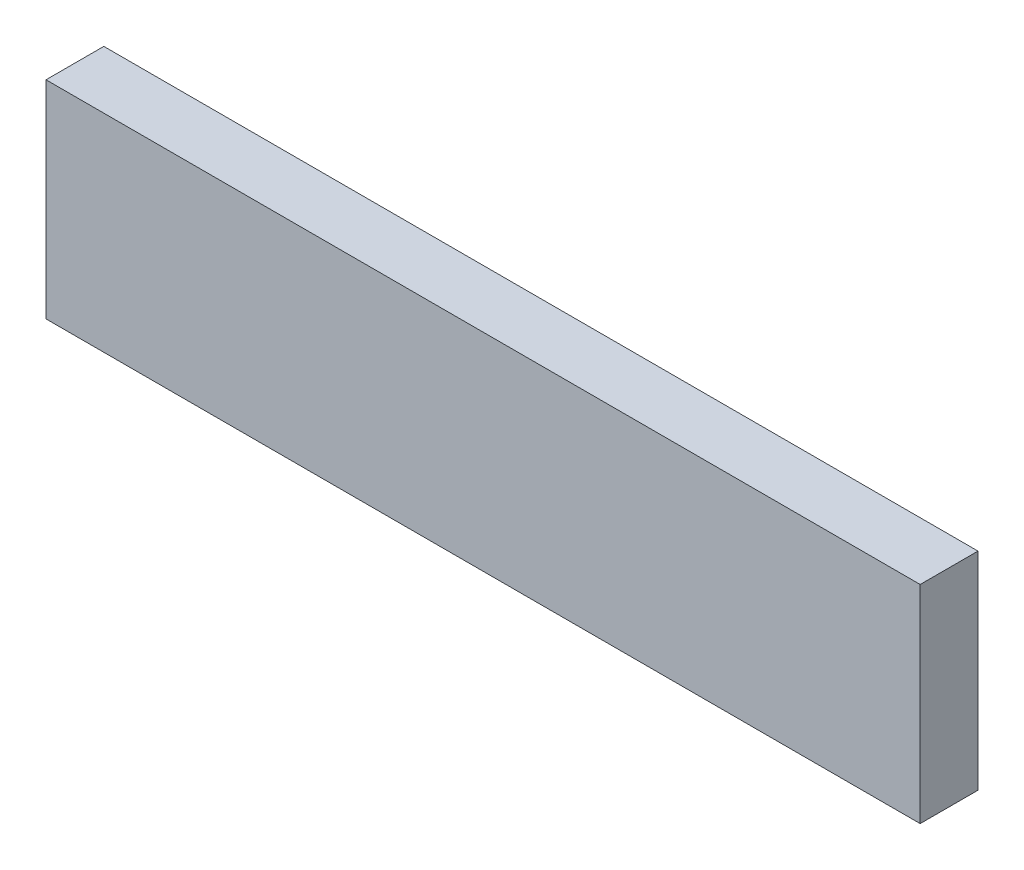
ISO-10303-21;
HEADER;
FILE_DESCRIPTION(('STEP AP214'),'2;1');
FILE_NAME('part.step','',(''),(''),'','','');
FILE_SCHEMA(('AUTOMOTIVE_DESIGN { 1 0 10303 214 1 1 1 1 }'));
ENDSEC;
DATA;
#1=APPLICATION_CONTEXT('core data for automotive mechanical design processes');
#2=APPLICATION_PROTOCOL_DEFINITION('international standard','automotive_design',2000,#1);
#3=PRODUCT_CONTEXT('',#1,'mechanical');
#4=PRODUCT('Part','Part','',(#3));
#5=PRODUCT_RELATED_PRODUCT_CATEGORY('part','',(#4));
#6=PRODUCT_DEFINITION_FORMATION('','',#4);
#7=PRODUCT_DEFINITION_CONTEXT('part definition',#1,'design');
#8=PRODUCT_DEFINITION('design','',#6,#7);
#9=PRODUCT_DEFINITION_SHAPE('','',#8);
#10=(LENGTH_UNIT() NAMED_UNIT(*) SI_UNIT(.MILLI.,.METRE.));
#11=(NAMED_UNIT(*) PLANE_ANGLE_UNIT() SI_UNIT($,.RADIAN.));
#12=(NAMED_UNIT(*) SI_UNIT($,.STERADIAN.) SOLID_ANGLE_UNIT());
#13=UNCERTAINTY_MEASURE_WITH_UNIT(LENGTH_MEASURE(1.E-05),#10,'distance_accuracy_value','');
#14=(GEOMETRIC_REPRESENTATION_CONTEXT(3) GLOBAL_UNCERTAINTY_ASSIGNED_CONTEXT((#13)) GLOBAL_UNIT_ASSIGNED_CONTEXT((#10,
#11,#12)) REPRESENTATION_CONTEXT('',''));
#15=CARTESIAN_POINT('',(0.,0.,0.));
#16=DIRECTION('',(0.,0.,1.));
#17=DIRECTION('',(1.,0.,0.));
#18=AXIS2_PLACEMENT_3D('',#15,#16,#17);
#19=CARTESIAN_POINT('',(-47.99,-11.37,6.35));
#20=DIRECTION('',(1.,0.,0.));
#21=DIRECTION('',(0.,0.,-1.));
#22=AXIS2_PLACEMENT_3D('',#19,#20,#21);
#23=PLANE('',#22);
#24=DIRECTION('',(0.,-1.,0.));
#25=VECTOR('',#24,1.);
#26=CARTESIAN_POINT('',(-47.99,-11.37,0.));
#27=LINE('',#26,#25);
#28=CARTESIAN_POINT('',(-47.99,11.37,0.));
#29=VERTEX_POINT('',#28);
#30=CARTESIAN_POINT('',(-47.99,-11.37,0.));
#31=VERTEX_POINT('',#30);
#32=EDGE_CURVE('E111',#29,#31,#27,.T.);
#33=ORIENTED_EDGE('',*,*,#32,.T.);
#34=DIRECTION('',(0.,0.,-1.));
#35=VECTOR('',#34,1.);
#36=CARTESIAN_POINT('',(-47.99,-11.37,6.35));
#37=LINE('',#36,#35);
#38=CARTESIAN_POINT('',(-47.99,-11.37,6.35));
#39=VERTEX_POINT('',#38);
#40=EDGE_CURVE('E11',#39,#31,#37,.T.);
#41=ORIENTED_EDGE('',*,*,#40,.F.);
#42=DIRECTION('',(0.,-1.,0.));
#43=VECTOR('',#42,1.);
#44=CARTESIAN_POINT('',(-47.99,-11.37,6.35));
#45=LINE('',#44,#43);
#46=CARTESIAN_POINT('',(-47.99,11.37,6.35));
#47=VERTEX_POINT('',#46);
#48=EDGE_CURVE('E95',#47,#39,#45,.T.);
#49=ORIENTED_EDGE('',*,*,#48,.F.);
#50=DIRECTION('',(0.,0.,-1.));
#51=VECTOR('',#50,1.);
#52=CARTESIAN_POINT('',(-47.99,11.37,6.35));
#53=LINE('',#52,#51);
#54=EDGE_CURVE('E107',#47,#29,#53,.T.);
#55=ORIENTED_EDGE('',*,*,#54,.T.);
#56=EDGE_LOOP('',(#33,#41,#49,#55));
#57=FACE_BOUND('',#56,.T.);
#58=ADVANCED_FACE('F43',(#57),#23,.F.);
#59=CARTESIAN_POINT('',(47.99,-11.37,6.35));
#60=DIRECTION('',(0.,1.,0.));
#61=DIRECTION('',(-1.,0.,0.));
#62=AXIS2_PLACEMENT_3D('',#59,#60,#61);
#63=PLANE('',#62);
#64=DIRECTION('',(1.,0.,0.));
#65=VECTOR('',#64,1.);
#66=CARTESIAN_POINT('',(47.99,-11.37,0.));
#67=LINE('',#66,#65);
#68=CARTESIAN_POINT('',(47.99,-11.37,0.));
#69=VERTEX_POINT('',#68);
#70=EDGE_CURVE('E100',#31,#69,#67,.T.);
#71=ORIENTED_EDGE('',*,*,#70,.T.);
#72=DIRECTION('',(0.,0.,-1.));
#73=VECTOR('',#72,1.);
#74=CARTESIAN_POINT('',(47.99,-11.37,6.35));
#75=LINE('',#74,#73);
#76=CARTESIAN_POINT('',(47.99,-11.37,6.35));
#77=VERTEX_POINT('',#76);
#78=EDGE_CURVE('E52',#77,#69,#75,.T.);
#79=ORIENTED_EDGE('',*,*,#78,.F.);
#80=DIRECTION('',(1.,0.,0.));
#81=VECTOR('',#80,1.);
#82=CARTESIAN_POINT('',(47.99,-11.37,6.35));
#83=LINE('',#82,#81);
#84=EDGE_CURVE('E90',#39,#77,#83,.T.);
#85=ORIENTED_EDGE('',*,*,#84,.F.);
#86=ORIENTED_EDGE('',*,*,#40,.T.);
#87=EDGE_LOOP('',(#71,#79,#85,#86));
#88=FACE_BOUND('',#87,.T.);
#89=ADVANCED_FACE('F99',(#88),#63,.F.);
#90=CARTESIAN_POINT('',(47.99,-11.37,6.35));
#91=DIRECTION('',(-1.,0.,0.));
#92=DIRECTION('',(0.,0.,1.));
#93=AXIS2_PLACEMENT_3D('',#90,#91,#92);
#94=PLANE('',#93);
#95=DIRECTION('',(0.,1.,0.));
#96=VECTOR('',#95,1.);
#97=CARTESIAN_POINT('',(47.99,-11.37,0.));
#98=LINE('',#97,#96);
#99=CARTESIAN_POINT('',(47.99,11.37,0.));
#100=VERTEX_POINT('',#99);
#101=EDGE_CURVE('E77',#69,#100,#98,.T.);
#102=ORIENTED_EDGE('',*,*,#101,.T.);
#103=DIRECTION('',(0.,0.,-1.));
#104=VECTOR('',#103,1.);
#105=CARTESIAN_POINT('',(47.99,11.37,6.35));
#106=LINE('',#105,#104);
#107=CARTESIAN_POINT('',(47.99,11.37,6.35));
#108=VERTEX_POINT('',#107);
#109=EDGE_CURVE('E102',#108,#100,#106,.T.);
#110=ORIENTED_EDGE('',*,*,#109,.F.);
#111=DIRECTION('',(0.,1.,0.));
#112=VECTOR('',#111,1.);
#113=CARTESIAN_POINT('',(47.99,-11.37,6.35));
#114=LINE('',#113,#112);
#115=EDGE_CURVE('E93',#77,#108,#114,.T.);
#116=ORIENTED_EDGE('',*,*,#115,.F.);
#117=ORIENTED_EDGE('',*,*,#78,.T.);
#118=EDGE_LOOP('',(#102,#110,#116,#117));
#119=FACE_BOUND('',#118,.T.);
#120=ADVANCED_FACE('F103',(#119),#94,.F.);
#121=CARTESIAN_POINT('',(47.99,11.37,6.35));
#122=DIRECTION('',(0.,-1.,0.));
#123=DIRECTION('',(1.,0.,0.));
#124=AXIS2_PLACEMENT_3D('',#121,#122,#123);
#125=PLANE('',#124);
#126=DIRECTION('',(-1.,0.,0.));
#127=VECTOR('',#126,1.);
#128=CARTESIAN_POINT('',(47.99,11.37,0.));
#129=LINE('',#128,#127);
#130=EDGE_CURVE('E83',#100,#29,#129,.T.);
#131=ORIENTED_EDGE('',*,*,#130,.T.);
#132=ORIENTED_EDGE('',*,*,#54,.F.);
#133=DIRECTION('',(-1.,0.,0.));
#134=VECTOR('',#133,1.);
#135=CARTESIAN_POINT('',(47.99,11.37,6.35));
#136=LINE('',#135,#134);
#137=EDGE_CURVE('E60',#108,#47,#136,.T.);
#138=ORIENTED_EDGE('',*,*,#137,.F.);
#139=ORIENTED_EDGE('',*,*,#109,.T.);
#140=EDGE_LOOP('',(#131,#132,#138,#139));
#141=FACE_BOUND('',#140,.T.);
#142=ADVANCED_FACE('F124',(#141),#125,.F.);
#143=CARTESIAN_POINT('',(0.,0.,6.35));
#144=DIRECTION('',(0.,0.,1.));
#145=DIRECTION('',(1.,0.,0.));
#146=AXIS2_PLACEMENT_3D('',#143,#144,#145);
#147=PLANE('',#146);
#148=ORIENTED_EDGE('',*,*,#48,.T.);
#149=ORIENTED_EDGE('',*,*,#84,.T.);
#150=ORIENTED_EDGE('',*,*,#115,.T.);
#151=ORIENTED_EDGE('',*,*,#137,.T.);
#152=EDGE_LOOP('',(#148,#149,#150,#151));
#153=FACE_BOUND('',#152,.T.);
#154=ADVANCED_FACE('F91',(#153),#147,.T.);
#155=CARTESIAN_POINT('',(0.,0.,0.));
#156=DIRECTION('',(0.,0.,1.));
#157=DIRECTION('',(1.,0.,0.));
#158=AXIS2_PLACEMENT_3D('',#155,#156,#157);
#159=PLANE('',#158);
#160=ORIENTED_EDGE('',*,*,#32,.F.);
#161=ORIENTED_EDGE('',*,*,#130,.F.);
#162=ORIENTED_EDGE('',*,*,#101,.F.);
#163=ORIENTED_EDGE('',*,*,#70,.F.);
#164=EDGE_LOOP('',(#160,#161,#162,#163));
#165=FACE_BOUND('',#164,.T.);
#166=ADVANCED_FACE('F127',(#165),#159,.F.);
#167=CLOSED_SHELL('',(#58,#89,#120,#142,#154,#166));
#168=MANIFOLD_SOLID_BREP('B2',#167);
#169=ADVANCED_BREP_SHAPE_REPRESENTATION('',(#18,#168),#14);
#170=SHAPE_DEFINITION_REPRESENTATION(#9,#169);
ENDSEC;
END-ISO-10303-21;
